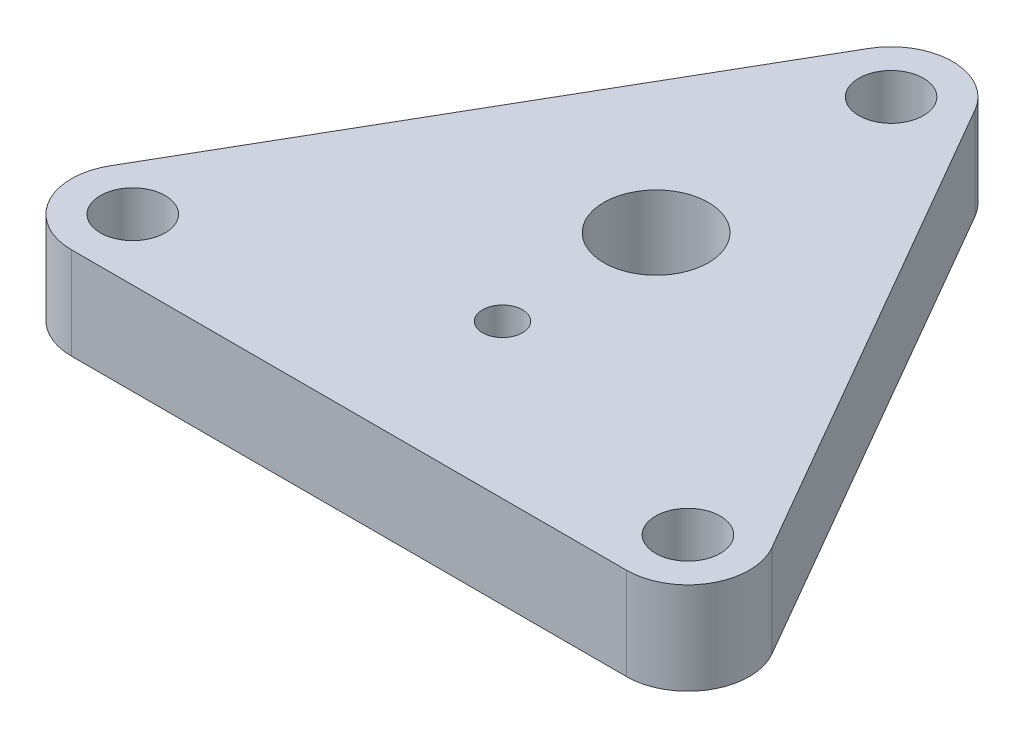
ISO-10303-21;
HEADER;
FILE_DESCRIPTION(('STEP AP214'),'2;1');
FILE_NAME('part.step','',(''),(''),'','','');
FILE_SCHEMA(('AUTOMOTIVE_DESIGN { 1 0 10303 214 1 1 1 1 }'));
ENDSEC;
DATA;
#1=APPLICATION_CONTEXT('core data for automotive mechanical design processes');
#2=APPLICATION_PROTOCOL_DEFINITION('international standard','automotive_design',2000,#1);
#3=PRODUCT_CONTEXT('',#1,'mechanical');
#4=PRODUCT('Part','Part','',(#3));
#5=PRODUCT_RELATED_PRODUCT_CATEGORY('part','',(#4));
#6=PRODUCT_DEFINITION_FORMATION('','',#4);
#7=PRODUCT_DEFINITION_CONTEXT('part definition',#1,'design');
#8=PRODUCT_DEFINITION('design','',#6,#7);
#9=PRODUCT_DEFINITION_SHAPE('','',#8);
#10=(LENGTH_UNIT() NAMED_UNIT(*) SI_UNIT(.MILLI.,.METRE.));
#11=(NAMED_UNIT(*) PLANE_ANGLE_UNIT() SI_UNIT($,.RADIAN.));
#12=(NAMED_UNIT(*) SI_UNIT($,.STERADIAN.) SOLID_ANGLE_UNIT());
#13=UNCERTAINTY_MEASURE_WITH_UNIT(LENGTH_MEASURE(1.E-05),#10,'distance_accuracy_value','');
#14=(GEOMETRIC_REPRESENTATION_CONTEXT(3) GLOBAL_UNCERTAINTY_ASSIGNED_CONTEXT((#13)) GLOBAL_UNIT_ASSIGNED_CONTEXT((#10,
#11,#12)) REPRESENTATION_CONTEXT('',''));
#15=CARTESIAN_POINT('',(0.,0.,0.));
#16=DIRECTION('',(0.,0.,1.));
#17=DIRECTION('',(1.,0.,0.));
#18=AXIS2_PLACEMENT_3D('',#15,#16,#17);
#19=CARTESIAN_POINT('',(9.0358983848623,3.,-2.));
#20=DIRECTION('',(0.,1.,0.));
#21=DIRECTION('',(0.,0.,1.));
#22=AXIS2_PLACEMENT_3D('',#19,#20,#21);
#23=PLANE('',#22);
#24=CARTESIAN_POINT('',(-6.22072580689757E-13,3.,-5.));
#25=DIRECTION('',(0.,1.,0.));
#26=DIRECTION('',(0.,0.,1.));
#27=AXIS2_PLACEMENT_3D('',#24,#25,#26);
#28=CIRCLE('',#27,0.65);
#29=CARTESIAN_POINT('',(-6.22072580689757E-13,3.,-4.35));
#30=VERTEX_POINT('',#29);
#31=EDGE_CURVE('E170',#30,#30,#28,.T.);
#32=ORIENTED_EDGE('',*,*,#31,.F.);
#33=EDGE_LOOP('',(#32));
#34=FACE_BOUND('',#33,.T.);
#35=CARTESIAN_POINT('',(-1.10202382932104E-12,3.,-10.));
#36=DIRECTION('',(0.,1.,0.));
#37=DIRECTION('',(0.,0.,1.));
#38=AXIS2_PLACEMENT_3D('',#35,#36,#37);
#39=CIRCLE('',#38,1.70200000000069);
#40=CARTESIAN_POINT('',(-1.10202382932104E-12,3.,-8.29799999999931));
#41=VERTEX_POINT('',#40);
#42=EDGE_CURVE('E164',#41,#41,#39,.T.);
#43=ORIENTED_EDGE('',*,*,#42,.F.);
#44=EDGE_LOOP('',(#43));
#45=FACE_BOUND('',#44,.T.);
#46=CARTESIAN_POINT('',(-9.03589838486223,3.,-2.));
#47=DIRECTION('',(0.,1.,0.));
#48=DIRECTION('',(0.,0.,1.));
#49=AXIS2_PLACEMENT_3D('',#46,#47,#48);
#50=CIRCLE('',#49,1.054);
#51=CARTESIAN_POINT('',(-9.03589838486223,3.,-0.945999999999999));
#52=VERTEX_POINT('',#51);
#53=EDGE_CURVE('E149',#52,#52,#50,.T.);
#54=ORIENTED_EDGE('',*,*,#53,.F.);
#55=EDGE_LOOP('',(#54));
#56=FACE_BOUND('',#55,.T.);
#57=DIRECTION('',(1.,0.,0.));
#58=VECTOR('',#57,1.);
#59=CARTESIAN_POINT('',(-9.03589838486198,3.,0.));
#60=LINE('',#59,#58);
#61=CARTESIAN_POINT('',(-9.03589838486198,3.,-1.07552855510562E-13));
#62=VERTEX_POINT('',#61);
#63=CARTESIAN_POINT('',(9.03589838486234,3.,0.));
#64=VERTEX_POINT('',#63);
#65=EDGE_CURVE('E85',#62,#64,#60,.T.);
#66=ORIENTED_EDGE('',*,*,#65,.T.);
#67=CARTESIAN_POINT('',(9.0358983848623,3.,-2.));
#68=DIRECTION('',(0.,1.,0.));
#69=DIRECTION('',(0.,0.,1.));
#70=AXIS2_PLACEMENT_3D('',#67,#68,#69);
#71=CIRCLE('',#70,2.00000000000002);
#72=CARTESIAN_POINT('',(10.7679491924312,3.,-2.99999999999997));
#73=VERTEX_POINT('',#72);
#74=EDGE_CURVE('E142',#64,#73,#71,.T.);
#75=ORIENTED_EDGE('',*,*,#74,.T.);
#76=DIRECTION('',(-0.499999999999992,0.,-0.866025403784444));
#77=VECTOR('',#76,1.);
#78=CARTESIAN_POINT('',(10.7679491924312,3.,-2.99999999999998));
#79=LINE('',#78,#77);
#80=CARTESIAN_POINT('',(1.73205080756922,3.,-18.6506350946109));
#81=VERTEX_POINT('',#80);
#82=EDGE_CURVE('E99',#73,#81,#79,.T.);
#83=ORIENTED_EDGE('',*,*,#82,.T.);
#84=CARTESIAN_POINT('',(1.90824453591173E-13,3.,-17.6506350946111));
#85=DIRECTION('',(0.,1.,0.));
#86=DIRECTION('',(0.,0.,1.));
#87=AXIS2_PLACEMENT_3D('',#84,#85,#86);
#88=CIRCLE('',#87,1.99999999999992);
#89=CARTESIAN_POINT('',(-1.73205080756865,3.,-18.650635094611));
#90=VERTEX_POINT('',#89);
#91=EDGE_CURVE('E93',#81,#90,#88,.T.);
#92=ORIENTED_EDGE('',*,*,#91,.T.);
#93=DIRECTION('',(-0.500000000000004,0.,0.866025403784436));
#94=VECTOR('',#93,1.);
#95=CARTESIAN_POINT('',(-1.73205080756854,3.,-18.6506350946109));
#96=LINE('',#95,#94);
#97=CARTESIAN_POINT('',(-10.7679491924308,3.,-3.00000000000001));
#98=VERTEX_POINT('',#97);
#99=EDGE_CURVE('E97',#90,#98,#96,.T.);
#100=ORIENTED_EDGE('',*,*,#99,.T.);
#101=CARTESIAN_POINT('',(-9.03589838486223,3.,-2.));
#102=DIRECTION('',(0.,1.,0.));
#103=DIRECTION('',(0.,0.,1.));
#104=AXIS2_PLACEMENT_3D('',#101,#102,#103);
#105=CIRCLE('',#104,1.99999999999989);
#106=EDGE_CURVE('E49',#98,#62,#105,.T.);
#107=ORIENTED_EDGE('',*,*,#106,.T.);
#108=EDGE_LOOP('',(#66,#75,#83,#92,#100,#107));
#109=FACE_BOUND('',#108,.T.);
#110=CARTESIAN_POINT('',(1.90824453591173E-13,3.,-17.6506350946111));
#111=DIRECTION('',(0.,1.,0.));
#112=DIRECTION('',(0.,0.,1.));
#113=AXIS2_PLACEMENT_3D('',#110,#111,#112);
#114=CIRCLE('',#113,1.054);
#115=CARTESIAN_POINT('',(1.90824453591173E-13,3.,-16.5966350946111));
#116=VERTEX_POINT('',#115);
#117=EDGE_CURVE('E119',#116,#116,#114,.T.);
#118=ORIENTED_EDGE('',*,*,#117,.F.);
#119=EDGE_LOOP('',(#118));
#120=FACE_BOUND('',#119,.T.);
#121=CARTESIAN_POINT('',(9.0358983848623,3.,-2.));
#122=DIRECTION('',(0.,1.,0.));
#123=DIRECTION('',(0.,0.,1.));
#124=AXIS2_PLACEMENT_3D('',#121,#122,#123);
#125=CIRCLE('',#124,1.054);
#126=CARTESIAN_POINT('',(9.0358983848623,3.,-0.946));
#127=VERTEX_POINT('',#126);
#128=EDGE_CURVE('E155',#127,#127,#125,.T.);
#129=ORIENTED_EDGE('',*,*,#128,.F.);
#130=EDGE_LOOP('',(#129));
#131=FACE_BOUND('',#130,.T.);
#132=ADVANCED_FACE('F32',(#34,#45,#56,#109,#120,#131),#23,.T.);
#133=CARTESIAN_POINT('',(9.0358983848623,0.,-2.));
#134=DIRECTION('',(0.,1.,0.));
#135=DIRECTION('',(0.,0.,1.));
#136=AXIS2_PLACEMENT_3D('',#133,#134,#135);
#137=PLANE('',#136);
#138=CARTESIAN_POINT('',(-6.22072580689757E-13,0.,-5.));
#139=DIRECTION('',(0.,1.,0.));
#140=DIRECTION('',(0.,0.,1.));
#141=AXIS2_PLACEMENT_3D('',#138,#139,#140);
#142=CIRCLE('',#141,0.65);
#143=CARTESIAN_POINT('',(-6.22072580689757E-13,0.,-4.35));
#144=VERTEX_POINT('',#143);
#145=EDGE_CURVE('E167',#144,#144,#142,.T.);
#146=ORIENTED_EDGE('',*,*,#145,.T.);
#147=EDGE_LOOP('',(#146));
#148=FACE_BOUND('',#147,.T.);
#149=CARTESIAN_POINT('',(-1.10202382932104E-12,0.,-10.));
#150=DIRECTION('',(0.,1.,0.));
#151=DIRECTION('',(0.,0.,1.));
#152=AXIS2_PLACEMENT_3D('',#149,#150,#151);
#153=CIRCLE('',#152,1.70200000000069);
#154=CARTESIAN_POINT('',(-1.10202382932104E-12,0.,-8.29799999999931));
#155=VERTEX_POINT('',#154);
#156=EDGE_CURVE('E161',#155,#155,#153,.T.);
#157=ORIENTED_EDGE('',*,*,#156,.T.);
#158=EDGE_LOOP('',(#157));
#159=FACE_BOUND('',#158,.T.);
#160=CARTESIAN_POINT('',(-9.03589838486223,0.,-2.));
#161=DIRECTION('',(0.,1.,0.));
#162=DIRECTION('',(0.,0.,1.));
#163=AXIS2_PLACEMENT_3D('',#160,#161,#162);
#164=CIRCLE('',#163,1.054);
#165=CARTESIAN_POINT('',(-9.03589838486223,0.,-0.945999999999999));
#166=VERTEX_POINT('',#165);
#167=EDGE_CURVE('E152',#166,#166,#164,.T.);
#168=ORIENTED_EDGE('',*,*,#167,.T.);
#169=EDGE_LOOP('',(#168));
#170=FACE_BOUND('',#169,.T.);
#171=DIRECTION('',(1.,0.,0.));
#172=VECTOR('',#171,1.);
#173=CARTESIAN_POINT('',(0.,0.,0.));
#174=LINE('',#173,#172);
#175=CARTESIAN_POINT('',(-9.03589838486198,0.,-1.07552855510562E-13));
#176=VERTEX_POINT('',#175);
#177=CARTESIAN_POINT('',(9.03589838486234,0.,0.));
#178=VERTEX_POINT('',#177);
#179=EDGE_CURVE('E79',#176,#178,#174,.T.);
#180=ORIENTED_EDGE('',*,*,#179,.F.);
#181=CARTESIAN_POINT('',(-9.03589838486223,0.,-2.));
#182=DIRECTION('',(0.,1.,0.));
#183=DIRECTION('',(0.,0.,1.));
#184=AXIS2_PLACEMENT_3D('',#181,#182,#183);
#185=CIRCLE('',#184,1.99999999999989);
#186=CARTESIAN_POINT('',(-10.7679491924308,0.,-3.00000000000001));
#187=VERTEX_POINT('',#186);
#188=EDGE_CURVE('E125',#187,#176,#185,.T.);
#189=ORIENTED_EDGE('',*,*,#188,.F.);
#190=DIRECTION('',(-0.500000000000004,0.,0.866025403784436));
#191=VECTOR('',#190,1.);
#192=CARTESIAN_POINT('',(-1.73205080756854,0.,-18.6506350946109));
#193=LINE('',#192,#191);
#194=CARTESIAN_POINT('',(-1.73205080756865,0.,-18.650635094611));
#195=VERTEX_POINT('',#194);
#196=EDGE_CURVE('E72',#195,#187,#193,.T.);
#197=ORIENTED_EDGE('',*,*,#196,.F.);
#198=CARTESIAN_POINT('',(1.90824453591173E-13,0.,-17.6506350946111));
#199=DIRECTION('',(0.,1.,0.));
#200=DIRECTION('',(0.,0.,1.));
#201=AXIS2_PLACEMENT_3D('',#198,#199,#200);
#202=CIRCLE('',#201,1.99999999999992);
#203=CARTESIAN_POINT('',(1.73205080756922,0.,-18.6506350946109));
#204=VERTEX_POINT('',#203);
#205=EDGE_CURVE('E107',#204,#195,#202,.T.);
#206=ORIENTED_EDGE('',*,*,#205,.F.);
#207=DIRECTION('',(-0.499999999999992,0.,-0.866025403784444));
#208=VECTOR('',#207,1.);
#209=CARTESIAN_POINT('',(10.7679491924312,0.,-2.99999999999998));
#210=LINE('',#209,#208);
#211=CARTESIAN_POINT('',(10.7679491924312,0.,-2.99999999999997));
#212=VERTEX_POINT('',#211);
#213=EDGE_CURVE('E121',#212,#204,#210,.T.);
#214=ORIENTED_EDGE('',*,*,#213,.F.);
#215=CARTESIAN_POINT('',(9.0358983848623,0.,-2.));
#216=DIRECTION('',(0.,1.,0.));
#217=DIRECTION('',(0.,0.,1.));
#218=AXIS2_PLACEMENT_3D('',#215,#216,#217);
#219=CIRCLE('',#218,2.00000000000002);
#220=EDGE_CURVE('E118',#178,#212,#219,.T.);
#221=ORIENTED_EDGE('',*,*,#220,.F.);
#222=EDGE_LOOP('',(#180,#189,#197,#206,#214,#221));
#223=FACE_BOUND('',#222,.T.);
#224=CARTESIAN_POINT('',(1.90824453591173E-13,0.,-17.6506350946111));
#225=DIRECTION('',(0.,1.,0.));
#226=DIRECTION('',(0.,0.,1.));
#227=AXIS2_PLACEMENT_3D('',#224,#225,#226);
#228=CIRCLE('',#227,1.054);
#229=CARTESIAN_POINT('',(1.90824453591173E-13,0.,-16.5966350946111));
#230=VERTEX_POINT('',#229);
#231=EDGE_CURVE('E146',#230,#230,#228,.T.);
#232=ORIENTED_EDGE('',*,*,#231,.T.);
#233=EDGE_LOOP('',(#232));
#234=FACE_BOUND('',#233,.T.);
#235=CARTESIAN_POINT('',(9.0358983848623,0.,-2.));
#236=DIRECTION('',(0.,1.,0.));
#237=DIRECTION('',(0.,0.,1.));
#238=AXIS2_PLACEMENT_3D('',#235,#236,#237);
#239=CIRCLE('',#238,1.054);
#240=CARTESIAN_POINT('',(9.0358983848623,0.,-0.946));
#241=VERTEX_POINT('',#240);
#242=EDGE_CURVE('E158',#241,#241,#239,.T.);
#243=ORIENTED_EDGE('',*,*,#242,.T.);
#244=EDGE_LOOP('',(#243));
#245=FACE_BOUND('',#244,.T.);
#246=ADVANCED_FACE('F137',(#148,#159,#170,#223,#234,#245),#137,.F.);
#247=CARTESIAN_POINT('',(0.,3.,0.));
#248=DIRECTION('',(0.,0.,-1.));
#249=DIRECTION('',(-1.,0.,0.));
#250=AXIS2_PLACEMENT_3D('',#247,#248,#249);
#251=PLANE('',#250);
#252=ORIENTED_EDGE('',*,*,#179,.T.);
#253=DIRECTION('',(0.,-1.,0.));
#254=VECTOR('',#253,1.);
#255=CARTESIAN_POINT('',(9.03589838486234,3.,0.));
#256=LINE('',#255,#254);
#257=EDGE_CURVE('E11',#64,#178,#256,.T.);
#258=ORIENTED_EDGE('',*,*,#257,.F.);
#259=ORIENTED_EDGE('',*,*,#65,.F.);
#260=DIRECTION('',(0.,-1.,0.));
#261=VECTOR('',#260,1.);
#262=CARTESIAN_POINT('',(-9.03589838486198,3.,-1.07552855510562E-13));
#263=LINE('',#262,#261);
#264=EDGE_CURVE('E113',#62,#176,#263,.T.);
#265=ORIENTED_EDGE('',*,*,#264,.T.);
#266=EDGE_LOOP('',(#252,#258,#259,#265));
#267=FACE_BOUND('',#266,.T.);
#268=ADVANCED_FACE('F34',(#267),#251,.F.);
#269=CARTESIAN_POINT('',(9.0358983848623,3.,-2.));
#270=DIRECTION('',(0.,-1.,0.));
#271=DIRECTION('',(0.,0.,-1.));
#272=AXIS2_PLACEMENT_3D('',#269,#270,#271);
#273=CYLINDRICAL_SURFACE('',#272,2.00000000000002);
#274=ORIENTED_EDGE('',*,*,#220,.T.);
#275=DIRECTION('',(0.,-1.,0.));
#276=VECTOR('',#275,1.);
#277=CARTESIAN_POINT('',(10.7679491924312,3.,-2.99999999999997));
#278=LINE('',#277,#276);
#279=EDGE_CURVE('E41',#73,#212,#278,.T.);
#280=ORIENTED_EDGE('',*,*,#279,.F.);
#281=ORIENTED_EDGE('',*,*,#74,.F.);
#282=ORIENTED_EDGE('',*,*,#257,.T.);
#283=EDGE_LOOP('',(#274,#280,#281,#282));
#284=FACE_BOUND('',#283,.T.);
#285=ADVANCED_FACE('F206',(#284),#273,.T.);
#286=CARTESIAN_POINT('',(10.7679491924312,3.,-2.99999999999998));
#287=DIRECTION('',(-0.866025403784443,0.,0.499999999999991));
#288=DIRECTION('',(0.499999999999992,0.,0.866025403784444));
#289=AXIS2_PLACEMENT_3D('',#286,#287,#288);
#290=PLANE('',#289);
#291=ORIENTED_EDGE('',*,*,#213,.T.);
#292=DIRECTION('',(0.,-1.,0.));
#293=VECTOR('',#292,1.);
#294=CARTESIAN_POINT('',(1.73205080756922,3.,-18.6506350946109));
#295=LINE('',#294,#293);
#296=EDGE_CURVE('E108',#81,#204,#295,.T.);
#297=ORIENTED_EDGE('',*,*,#296,.F.);
#298=ORIENTED_EDGE('',*,*,#82,.F.);
#299=ORIENTED_EDGE('',*,*,#279,.T.);
#300=EDGE_LOOP('',(#291,#297,#298,#299));
#301=FACE_BOUND('',#300,.T.);
#302=ADVANCED_FACE('F134',(#301),#290,.F.);
#303=CARTESIAN_POINT('',(1.90824453591173E-13,3.,-17.6506350946111));
#304=DIRECTION('',(0.,-1.,0.));
#305=DIRECTION('',(0.,0.,-1.));
#306=AXIS2_PLACEMENT_3D('',#303,#304,#305);
#307=CYLINDRICAL_SURFACE('',#306,1.99999999999992);
#308=ORIENTED_EDGE('',*,*,#205,.T.);
#309=DIRECTION('',(0.,-1.,0.));
#310=VECTOR('',#309,1.);
#311=CARTESIAN_POINT('',(-1.73205080756865,3.,-18.650635094611));
#312=LINE('',#311,#310);
#313=EDGE_CURVE('E104',#90,#195,#312,.T.);
#314=ORIENTED_EDGE('',*,*,#313,.F.);
#315=ORIENTED_EDGE('',*,*,#91,.F.);
#316=ORIENTED_EDGE('',*,*,#296,.T.);
#317=EDGE_LOOP('',(#308,#314,#315,#316));
#318=FACE_BOUND('',#317,.T.);
#319=ADVANCED_FACE('F105',(#318),#307,.T.);
#320=CARTESIAN_POINT('',(-1.73205080756854,3.,-18.6506350946109));
#321=DIRECTION('',(0.866025403784436,0.,0.500000000000004));
#322=DIRECTION('',(0.500000000000004,0.,-0.866025403784436));
#323=AXIS2_PLACEMENT_3D('',#320,#321,#322);
#324=PLANE('',#323);
#325=ORIENTED_EDGE('',*,*,#196,.T.);
#326=DIRECTION('',(0.,-1.,0.));
#327=VECTOR('',#326,1.);
#328=CARTESIAN_POINT('',(-10.7679491924308,3.,-3.00000000000001));
#329=LINE('',#328,#327);
#330=EDGE_CURVE('E109',#98,#187,#329,.T.);
#331=ORIENTED_EDGE('',*,*,#330,.F.);
#332=ORIENTED_EDGE('',*,*,#99,.F.);
#333=ORIENTED_EDGE('',*,*,#313,.T.);
#334=EDGE_LOOP('',(#325,#331,#332,#333));
#335=FACE_BOUND('',#334,.T.);
#336=ADVANCED_FACE('F111',(#335),#324,.F.);
#337=CARTESIAN_POINT('',(-9.03589838486223,3.,-2.));
#338=DIRECTION('',(0.,-1.,0.));
#339=DIRECTION('',(0.,0.,-1.));
#340=AXIS2_PLACEMENT_3D('',#337,#338,#339);
#341=CYLINDRICAL_SURFACE('',#340,1.99999999999989);
#342=ORIENTED_EDGE('',*,*,#188,.T.);
#343=ORIENTED_EDGE('',*,*,#264,.F.);
#344=ORIENTED_EDGE('',*,*,#106,.F.);
#345=ORIENTED_EDGE('',*,*,#330,.T.);
#346=EDGE_LOOP('',(#342,#343,#344,#345));
#347=FACE_BOUND('',#346,.T.);
#348=ADVANCED_FACE('F140',(#347),#341,.T.);
#349=CARTESIAN_POINT('',(1.90824453591173E-13,3.,-17.6506350946111));
#350=DIRECTION('',(0.,-1.,0.));
#351=DIRECTION('',(0.,0.,-1.));
#352=AXIS2_PLACEMENT_3D('',#349,#350,#351);
#353=CYLINDRICAL_SURFACE('',#352,1.054);
#354=ORIENTED_EDGE('',*,*,#117,.T.);
#355=EDGE_LOOP('',(#354));
#356=FACE_BOUND('',#355,.T.);
#357=ORIENTED_EDGE('',*,*,#231,.F.);
#358=EDGE_LOOP('',(#357));
#359=FACE_BOUND('',#358,.T.);
#360=ADVANCED_FACE('F196',(#356,#359),#353,.F.);
#361=CARTESIAN_POINT('',(-9.03589838486223,3.,-2.));
#362=DIRECTION('',(0.,-1.,0.));
#363=DIRECTION('',(0.,0.,-1.));
#364=AXIS2_PLACEMENT_3D('',#361,#362,#363);
#365=CYLINDRICAL_SURFACE('',#364,1.054);
#366=ORIENTED_EDGE('',*,*,#53,.T.);
#367=EDGE_LOOP('',(#366));
#368=FACE_BOUND('',#367,.T.);
#369=ORIENTED_EDGE('',*,*,#167,.F.);
#370=EDGE_LOOP('',(#369));
#371=FACE_BOUND('',#370,.T.);
#372=ADVANCED_FACE('F192',(#368,#371),#365,.F.);
#373=CARTESIAN_POINT('',(9.0358983848623,3.,-2.));
#374=DIRECTION('',(0.,-1.,0.));
#375=DIRECTION('',(0.,0.,-1.));
#376=AXIS2_PLACEMENT_3D('',#373,#374,#375);
#377=CYLINDRICAL_SURFACE('',#376,1.054);
#378=ORIENTED_EDGE('',*,*,#128,.T.);
#379=EDGE_LOOP('',(#378));
#380=FACE_BOUND('',#379,.T.);
#381=ORIENTED_EDGE('',*,*,#242,.F.);
#382=EDGE_LOOP('',(#381));
#383=FACE_BOUND('',#382,.T.);
#384=ADVANCED_FACE('F195',(#380,#383),#377,.F.);
#385=CARTESIAN_POINT('',(-1.10202382932104E-12,0.,-10.));
#386=DIRECTION('',(0.,1.,0.));
#387=DIRECTION('',(0.,0.,1.));
#388=AXIS2_PLACEMENT_3D('',#385,#386,#387);
#389=CYLINDRICAL_SURFACE('',#388,1.70200000000069);
#390=ORIENTED_EDGE('',*,*,#156,.F.);
#391=EDGE_LOOP('',(#390));
#392=FACE_BOUND('',#391,.T.);
#393=ORIENTED_EDGE('',*,*,#42,.T.);
#394=EDGE_LOOP('',(#393));
#395=FACE_BOUND('',#394,.T.);
#396=ADVANCED_FACE('F181',(#392,#395),#389,.F.);
#397=CARTESIAN_POINT('',(-6.22072580689757E-13,0.,-5.));
#398=DIRECTION('',(0.,1.,0.));
#399=DIRECTION('',(0.,0.,1.));
#400=AXIS2_PLACEMENT_3D('',#397,#398,#399);
#401=CYLINDRICAL_SURFACE('',#400,0.65);
#402=ORIENTED_EDGE('',*,*,#145,.F.);
#403=EDGE_LOOP('',(#402));
#404=FACE_BOUND('',#403,.T.);
#405=ORIENTED_EDGE('',*,*,#31,.T.);
#406=EDGE_LOOP('',(#405));
#407=FACE_BOUND('',#406,.T.);
#408=ADVANCED_FACE('F178',(#404,#407),#401,.F.);
#409=CLOSED_SHELL('',(#132,#246,#268,#285,#302,#319,#336,#348,#360,#372,#384,#396,#408));
#410=MANIFOLD_SOLID_BREP('B2',#409);
#411=ADVANCED_BREP_SHAPE_REPRESENTATION('',(#18,#410),#14);
#412=SHAPE_DEFINITION_REPRESENTATION(#9,#411);
ENDSEC;
END-ISO-10303-21;
